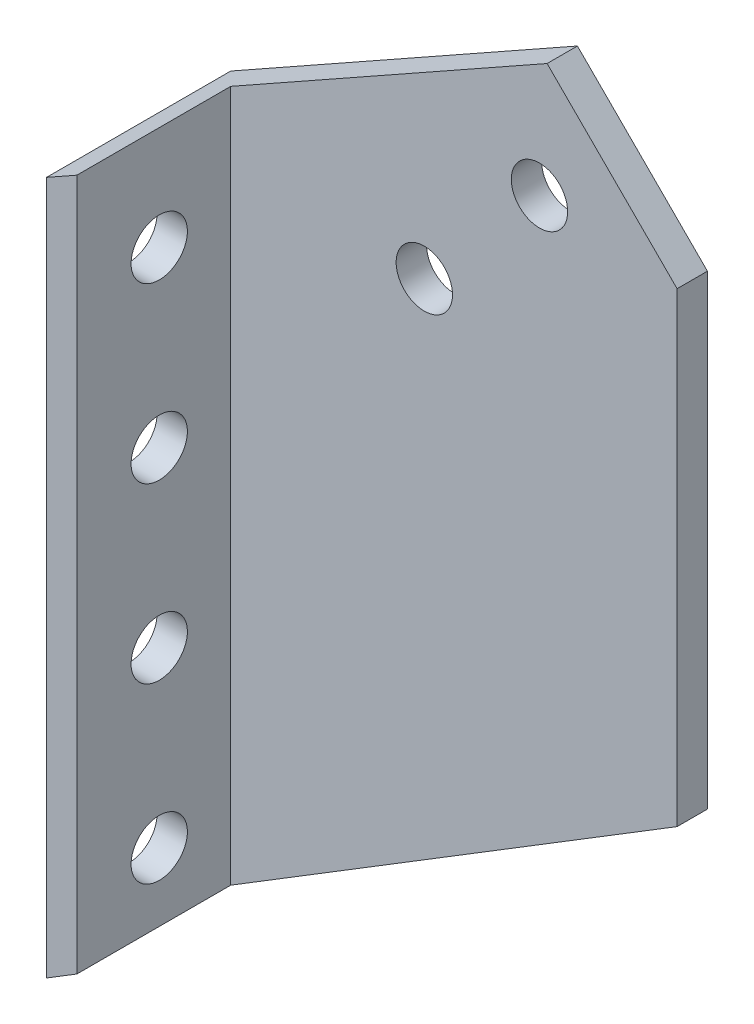
ISO-10303-21;
HEADER;
FILE_DESCRIPTION(('STEP AP214'),'2;1');
FILE_NAME('part.step','',(''),(''),'','','');
FILE_SCHEMA(('AUTOMOTIVE_DESIGN { 1 0 10303 214 1 1 1 1 }'));
ENDSEC;
DATA;
#1=APPLICATION_CONTEXT('core data for automotive mechanical design processes');
#2=APPLICATION_PROTOCOL_DEFINITION('international standard','automotive_design',2000,#1);
#3=PRODUCT_CONTEXT('',#1,'mechanical');
#4=PRODUCT('Part','Part','',(#3));
#5=PRODUCT_RELATED_PRODUCT_CATEGORY('part','',(#4));
#6=PRODUCT_DEFINITION_FORMATION('','',#4);
#7=PRODUCT_DEFINITION_CONTEXT('part definition',#1,'design');
#8=PRODUCT_DEFINITION('design','',#6,#7);
#9=PRODUCT_DEFINITION_SHAPE('','',#8);
#10=(LENGTH_UNIT() NAMED_UNIT(*) SI_UNIT(.MILLI.,.METRE.));
#11=(NAMED_UNIT(*) PLANE_ANGLE_UNIT() SI_UNIT($,.RADIAN.));
#12=(NAMED_UNIT(*) SI_UNIT($,.STERADIAN.) SOLID_ANGLE_UNIT());
#13=UNCERTAINTY_MEASURE_WITH_UNIT(LENGTH_MEASURE(1.E-05),#10,'distance_accuracy_value','');
#14=(GEOMETRIC_REPRESENTATION_CONTEXT(3) GLOBAL_UNCERTAINTY_ASSIGNED_CONTEXT((#13)) GLOBAL_UNIT_ASSIGNED_CONTEXT((#10,
#11,#12)) REPRESENTATION_CONTEXT('',''));
#15=CARTESIAN_POINT('',(0.,0.,0.));
#16=DIRECTION('',(0.,0.,1.));
#17=DIRECTION('',(1.,0.,0.));
#18=AXIS2_PLACEMENT_3D('',#15,#16,#17);
#19=CARTESIAN_POINT('',(233.582996255987,153.383897007896,14.));
#20=DIRECTION('',(0.,0.,1.));
#21=DIRECTION('',(1.,0.,0.));
#22=AXIS2_PLACEMENT_3D('',#19,#20,#21);
#23=PLANE('',#22);
#24=DIRECTION('',(0.,1.,0.));
#25=VECTOR('',#24,1.);
#26=CARTESIAN_POINT('',(-105.656440363729,264.498333627615,14.));
#27=LINE('',#26,#25);
#28=CARTESIAN_POINT('',(-105.656440363729,-54.7857572814754,14.));
#29=VERTEX_POINT('',#28);
#30=CARTESIAN_POINT('',(-105.656440363729,264.498333627615,14.));
#31=VERTEX_POINT('',#30);
#32=EDGE_CURVE('E52',#29,#31,#27,.T.);
#33=ORIENTED_EDGE('',*,*,#32,.F.);
#34=DIRECTION('',(0.852322728648666,0.52301621985259,0.));
#35=VECTOR('',#34,1.);
#36=CARTESIAN_POINT('',(-119.656440363729,-63.3766663723846,14.));
#37=LINE('',#36,#35);
#38=CARTESIAN_POINT('',(100.343559636271,71.6233336276154,14.));
#39=VERTEX_POINT('',#38);
#40=EDGE_CURVE('E85',#29,#39,#37,.T.);
#41=ORIENTED_EDGE('',*,*,#40,.T.);
#42=DIRECTION('',(0.,1.,0.));
#43=VECTOR('',#42,1.);
#44=CARTESIAN_POINT('',(100.343559636271,71.6233336276154,14.));
#45=LINE('',#44,#43);
#46=CARTESIAN_POINT('',(100.343559636271,286.623333627615,14.));
#47=VERTEX_POINT('',#46);
#48=EDGE_CURVE('E202',#39,#47,#45,.T.);
#49=ORIENTED_EDGE('',*,*,#48,.T.);
#50=DIRECTION('',(-0.70710678118654,0.707106781186555,0.));
#51=VECTOR('',#50,1.);
#52=CARTESIAN_POINT('',(100.343559636271,286.623333627615,14.));
#53=LINE('',#52,#51);
#54=CARTESIAN_POINT('',(40.3435596362774,346.62333362761,14.));
#55=VERTEX_POINT('',#54);
#56=EDGE_CURVE('E59',#47,#55,#53,.T.);
#57=ORIENTED_EDGE('',*,*,#56,.T.);
#58=DIRECTION('',(-0.87157553712457,-0.490261239632521,0.));
#59=VECTOR('',#58,1.);
#60=CARTESIAN_POINT('',(40.3435596362774,346.62333362761,14.));
#61=LINE('',#60,#59);
#62=EDGE_CURVE('E140',#55,#31,#61,.T.);
#63=ORIENTED_EDGE('',*,*,#62,.T.);
#64=EDGE_LOOP('',(#33,#41,#49,#57,#63));
#65=FACE_BOUND('',#64,.T.);
#66=CARTESIAN_POINT('',(-16.3182150153104,232.316337144602,14.));
#67=DIRECTION('',(0.,0.,1.));
#68=DIRECTION('',(1.,0.,0.));
#69=AXIS2_PLACEMENT_3D('',#66,#67,#68);
#70=CIRCLE('',#69,13.);
#71=CARTESIAN_POINT('',(-3.31821501531039,232.316337144602,14.));
#72=VERTEX_POINT('',#71);
#73=EDGE_CURVE('E212',#72,#72,#70,.T.);
#74=ORIENTED_EDGE('',*,*,#73,.F.);
#75=EDGE_LOOP('',(#74));
#76=FACE_BOUND('',#75,.T.);
#77=CARTESIAN_POINT('',(36.8308920910834,292.109082639294,14.));
#78=DIRECTION('',(0.,0.,1.));
#79=DIRECTION('',(1.,0.,0.));
#80=AXIS2_PLACEMENT_3D('',#77,#78,#79);
#81=CIRCLE('',#80,13.);
#82=CARTESIAN_POINT('',(49.8308920910834,292.109082639294,14.));
#83=VERTEX_POINT('',#82);
#84=EDGE_CURVE('E136',#83,#83,#81,.T.);
#85=ORIENTED_EDGE('',*,*,#84,.F.);
#86=EDGE_LOOP('',(#85));
#87=FACE_BOUND('',#86,.T.);
#88=ADVANCED_FACE('F35',(#65,#76,#87),#23,.T.);
#89=CARTESIAN_POINT('',(233.582996255987,153.383897007896,0.));
#90=DIRECTION('',(0.,0.,1.));
#91=DIRECTION('',(1.,0.,0.));
#92=AXIS2_PLACEMENT_3D('',#89,#90,#91);
#93=PLANE('',#92);
#94=CARTESIAN_POINT('',(-16.3182150153104,232.316337144602,0.));
#95=DIRECTION('',(0.,0.,1.));
#96=DIRECTION('',(1.,0.,0.));
#97=AXIS2_PLACEMENT_3D('',#94,#95,#96);
#98=CIRCLE('',#97,13.);
#99=CARTESIAN_POINT('',(-3.31821501531039,232.316337144602,0.));
#100=VERTEX_POINT('',#99);
#101=EDGE_CURVE('E222',#100,#100,#98,.T.);
#102=ORIENTED_EDGE('',*,*,#101,.T.);
#103=EDGE_LOOP('',(#102));
#104=FACE_BOUND('',#103,.T.);
#105=DIRECTION('',(0.852322728648666,0.52301621985259,0.));
#106=VECTOR('',#105,1.);
#107=CARTESIAN_POINT('',(-119.656440363729,-63.3766663723846,0.));
#108=LINE('',#107,#106);
#109=CARTESIAN_POINT('',(-119.656440363729,-63.3766663723846,0.));
#110=VERTEX_POINT('',#109);
#111=CARTESIAN_POINT('',(100.343559636271,71.6233336276154,0.));
#112=VERTEX_POINT('',#111);
#113=EDGE_CURVE('E208',#110,#112,#108,.T.);
#114=ORIENTED_EDGE('',*,*,#113,.F.);
#115=DIRECTION('',(0.,-1.,0.));
#116=VECTOR('',#115,1.);
#117=CARTESIAN_POINT('',(-119.656440363729,-63.3766663723846,0.));
#118=LINE('',#117,#116);
#119=CARTESIAN_POINT('',(-119.656440363729,256.623333627615,0.));
#120=VERTEX_POINT('',#119);
#121=EDGE_CURVE('E83',#120,#110,#118,.T.);
#122=ORIENTED_EDGE('',*,*,#121,.F.);
#123=DIRECTION('',(-0.87157553712457,-0.490261239632521,0.));
#124=VECTOR('',#123,1.);
#125=CARTESIAN_POINT('',(40.3435596362774,346.62333362761,0.));
#126=LINE('',#125,#124);
#127=CARTESIAN_POINT('',(40.3435596362774,346.62333362761,0.));
#128=VERTEX_POINT('',#127);
#129=EDGE_CURVE('E109',#128,#120,#126,.T.);
#130=ORIENTED_EDGE('',*,*,#129,.F.);
#131=DIRECTION('',(-0.70710678118654,0.707106781186555,0.));
#132=VECTOR('',#131,1.);
#133=CARTESIAN_POINT('',(100.343559636271,286.623333627615,0.));
#134=LINE('',#133,#132);
#135=CARTESIAN_POINT('',(100.343559636271,286.623333627615,0.));
#136=VERTEX_POINT('',#135);
#137=EDGE_CURVE('E214',#136,#128,#134,.T.);
#138=ORIENTED_EDGE('',*,*,#137,.F.);
#139=DIRECTION('',(0.,1.,0.));
#140=VECTOR('',#139,1.);
#141=CARTESIAN_POINT('',(100.343559636271,71.6233336276154,0.));
#142=LINE('',#141,#140);
#143=EDGE_CURVE('E211',#112,#136,#142,.T.);
#144=ORIENTED_EDGE('',*,*,#143,.F.);
#145=EDGE_LOOP('',(#114,#122,#130,#138,#144));
#146=FACE_BOUND('',#145,.T.);
#147=CARTESIAN_POINT('',(36.8308920910834,292.109082639294,0.));
#148=DIRECTION('',(0.,0.,1.));
#149=DIRECTION('',(1.,0.,0.));
#150=AXIS2_PLACEMENT_3D('',#147,#148,#149);
#151=CIRCLE('',#150,13.);
#152=CARTESIAN_POINT('',(49.8308920910834,292.109082639294,0.));
#153=VERTEX_POINT('',#152);
#154=EDGE_CURVE('E149',#153,#153,#151,.T.);
#155=ORIENTED_EDGE('',*,*,#154,.T.);
#156=EDGE_LOOP('',(#155));
#157=FACE_BOUND('',#156,.T.);
#158=ADVANCED_FACE('F235',(#104,#146,#157),#93,.F.);
#159=CARTESIAN_POINT('',(-119.656440363729,-63.3766663723846,14.));
#160=DIRECTION('',(-0.52301621985259,0.852322728648666,0.));
#161=DIRECTION('',(-0.852322728648666,-0.52301621985259,0.));
#162=AXIS2_PLACEMENT_3D('',#159,#160,#161);
#163=PLANE('',#162);
#164=ORIENTED_EDGE('',*,*,#113,.T.);
#165=DIRECTION('',(0.,0.,-1.));
#166=VECTOR('',#165,1.);
#167=CARTESIAN_POINT('',(100.343559636271,71.6233336276154,14.));
#168=LINE('',#167,#166);
#169=EDGE_CURVE('E11',#39,#112,#168,.T.);
#170=ORIENTED_EDGE('',*,*,#169,.F.);
#171=ORIENTED_EDGE('',*,*,#40,.F.);
#172=DIRECTION('',(0.,0.,-1.));
#173=VECTOR('',#172,1.);
#174=CARTESIAN_POINT('',(-105.656440363729,-54.7857572814754,85.));
#175=LINE('',#174,#173);
#176=CARTESIAN_POINT('',(-105.656440363729,-54.7857572814754,85.));
#177=VERTEX_POINT('',#176);
#178=EDGE_CURVE('E144',#177,#29,#175,.T.);
#179=ORIENTED_EDGE('',*,*,#178,.F.);
#180=DIRECTION('',(0.852322728648666,0.52301621985259,0.));
#181=VECTOR('',#180,1.);
#182=CARTESIAN_POINT('',(-119.656440363729,-63.3766663723846,85.));
#183=LINE('',#182,#181);
#184=CARTESIAN_POINT('',(-119.656440363729,-63.3766663723846,85.));
#185=VERTEX_POINT('',#184);
#186=EDGE_CURVE('E118',#185,#177,#183,.T.);
#187=ORIENTED_EDGE('',*,*,#186,.F.);
#188=DIRECTION('',(0.,0.,-1.));
#189=VECTOR('',#188,1.);
#190=CARTESIAN_POINT('',(-119.656440363729,-63.3766663723846,14.));
#191=LINE('',#190,#189);
#192=EDGE_CURVE('E111',#185,#110,#191,.T.);
#193=ORIENTED_EDGE('',*,*,#192,.T.);
#194=EDGE_LOOP('',(#164,#170,#171,#179,#187,#193));
#195=FACE_BOUND('',#194,.T.);
#196=ADVANCED_FACE('F37',(#195),#163,.F.);
#197=CARTESIAN_POINT('',(100.343559636271,71.6233336276154,14.));
#198=DIRECTION('',(-1.,0.,0.));
#199=DIRECTION('',(0.,0.,1.));
#200=AXIS2_PLACEMENT_3D('',#197,#198,#199);
#201=PLANE('',#200);
#202=ORIENTED_EDGE('',*,*,#143,.T.);
#203=DIRECTION('',(0.,0.,-1.));
#204=VECTOR('',#203,1.);
#205=CARTESIAN_POINT('',(100.343559636271,286.623333627615,14.));
#206=LINE('',#205,#204);
#207=EDGE_CURVE('E44',#47,#136,#206,.T.);
#208=ORIENTED_EDGE('',*,*,#207,.F.);
#209=ORIENTED_EDGE('',*,*,#48,.F.);
#210=ORIENTED_EDGE('',*,*,#169,.T.);
#211=EDGE_LOOP('',(#202,#208,#209,#210));
#212=FACE_BOUND('',#211,.T.);
#213=ADVANCED_FACE('F250',(#212),#201,.F.);
#214=CARTESIAN_POINT('',(100.343559636271,286.623333627615,14.));
#215=DIRECTION('',(-0.707106781186555,-0.70710678118654,0.));
#216=DIRECTION('',(0.70710678118654,-0.707106781186555,0.));
#217=AXIS2_PLACEMENT_3D('',#214,#215,#216);
#218=PLANE('',#217);
#219=ORIENTED_EDGE('',*,*,#137,.T.);
#220=DIRECTION('',(0.,0.,-1.));
#221=VECTOR('',#220,1.);
#222=CARTESIAN_POINT('',(40.3435596362774,346.62333362761,14.));
#223=LINE('',#222,#221);
#224=EDGE_CURVE('E110',#55,#128,#223,.T.);
#225=ORIENTED_EDGE('',*,*,#224,.F.);
#226=ORIENTED_EDGE('',*,*,#56,.F.);
#227=ORIENTED_EDGE('',*,*,#207,.T.);
#228=EDGE_LOOP('',(#219,#225,#226,#227));
#229=FACE_BOUND('',#228,.T.);
#230=ADVANCED_FACE('F248',(#229),#218,.F.);
#231=CARTESIAN_POINT('',(40.3435596362774,346.62333362761,14.));
#232=DIRECTION('',(0.490261239632521,-0.87157553712457,0.));
#233=DIRECTION('',(0.87157553712457,0.490261239632521,0.));
#234=AXIS2_PLACEMENT_3D('',#231,#232,#233);
#235=PLANE('',#234);
#236=ORIENTED_EDGE('',*,*,#129,.T.);
#237=DIRECTION('',(0.,0.,-1.));
#238=VECTOR('',#237,1.);
#239=CARTESIAN_POINT('',(-119.656440363729,256.623333627615,14.));
#240=LINE('',#239,#238);
#241=CARTESIAN_POINT('',(-119.656440363729,256.623333627615,85.));
#242=VERTEX_POINT('',#241);
#243=EDGE_CURVE('E101',#242,#120,#240,.T.);
#244=ORIENTED_EDGE('',*,*,#243,.F.);
#245=DIRECTION('',(-0.871575537124571,-0.490261239632521,0.));
#246=VECTOR('',#245,1.);
#247=CARTESIAN_POINT('',(-105.656440363729,264.498333627615,85.));
#248=LINE('',#247,#246);
#249=CARTESIAN_POINT('',(-105.656440363729,264.498333627615,85.));
#250=VERTEX_POINT('',#249);
#251=EDGE_CURVE('E106',#250,#242,#248,.T.);
#252=ORIENTED_EDGE('',*,*,#251,.F.);
#253=DIRECTION('',(0.,0.,-1.));
#254=VECTOR('',#253,1.);
#255=CARTESIAN_POINT('',(-105.656440363729,264.498333627615,85.));
#256=LINE('',#255,#254);
#257=EDGE_CURVE('E133',#250,#31,#256,.T.);
#258=ORIENTED_EDGE('',*,*,#257,.T.);
#259=ORIENTED_EDGE('',*,*,#62,.F.);
#260=ORIENTED_EDGE('',*,*,#224,.T.);
#261=EDGE_LOOP('',(#236,#244,#252,#258,#259,#260));
#262=FACE_BOUND('',#261,.T.);
#263=ADVANCED_FACE('F103',(#262),#235,.F.);
#264=CARTESIAN_POINT('',(-119.656440363729,-63.3766663723846,14.));
#265=DIRECTION('',(1.,0.,0.));
#266=DIRECTION('',(0.,1.,0.));
#267=AXIS2_PLACEMENT_3D('',#264,#265,#266);
#268=PLANE('',#267);
#269=CARTESIAN_POINT('',(-119.656440363729,-23.3766663723845,47.));
#270=DIRECTION('',(-1.,0.,0.));
#271=DIRECTION('',(0.,-1.,0.));
#272=AXIS2_PLACEMENT_3D('',#269,#270,#271);
#273=CIRCLE('',#272,13.);
#274=CARTESIAN_POINT('',(-119.656440363729,-36.3766663723845,47.));
#275=VERTEX_POINT('',#274);
#276=EDGE_CURVE('E168',#275,#275,#273,.T.);
#277=ORIENTED_EDGE('',*,*,#276,.F.);
#278=EDGE_LOOP('',(#277));
#279=FACE_BOUND('',#278,.T.);
#280=CARTESIAN_POINT('',(-119.656440363729,56.6233336276155,47.));
#281=DIRECTION('',(-1.,0.,0.));
#282=DIRECTION('',(0.,-1.,0.));
#283=AXIS2_PLACEMENT_3D('',#280,#281,#282);
#284=CIRCLE('',#283,13.);
#285=CARTESIAN_POINT('',(-119.656440363729,43.6233336276155,47.));
#286=VERTEX_POINT('',#285);
#287=EDGE_CURVE('E159',#286,#286,#284,.T.);
#288=ORIENTED_EDGE('',*,*,#287,.F.);
#289=EDGE_LOOP('',(#288));
#290=FACE_BOUND('',#289,.T.);
#291=CARTESIAN_POINT('',(-119.656440363729,136.623333627615,47.));
#292=DIRECTION('',(-1.,0.,0.));
#293=DIRECTION('',(0.,-1.,0.));
#294=AXIS2_PLACEMENT_3D('',#291,#292,#293);
#295=CIRCLE('',#294,13.);
#296=CARTESIAN_POINT('',(-119.656440363729,123.623333627615,47.));
#297=VERTEX_POINT('',#296);
#298=EDGE_CURVE('E156',#297,#297,#295,.T.);
#299=ORIENTED_EDGE('',*,*,#298,.F.);
#300=EDGE_LOOP('',(#299));
#301=FACE_BOUND('',#300,.T.);
#302=CARTESIAN_POINT('',(-119.656440363729,216.623333627615,47.));
#303=DIRECTION('',(-1.,0.,0.));
#304=DIRECTION('',(0.,-1.,0.));
#305=AXIS2_PLACEMENT_3D('',#302,#303,#304);
#306=CIRCLE('',#305,13.);
#307=CARTESIAN_POINT('',(-119.656440363729,203.623333627615,47.));
#308=VERTEX_POINT('',#307);
#309=EDGE_CURVE('E128',#308,#308,#306,.T.);
#310=ORIENTED_EDGE('',*,*,#309,.F.);
#311=EDGE_LOOP('',(#310));
#312=FACE_BOUND('',#311,.T.);
#313=ORIENTED_EDGE('',*,*,#121,.T.);
#314=ORIENTED_EDGE('',*,*,#192,.F.);
#315=DIRECTION('',(0.,-1.,0.));
#316=VECTOR('',#315,1.);
#317=CARTESIAN_POINT('',(-119.656440363729,256.623333627615,85.));
#318=LINE('',#317,#316);
#319=EDGE_CURVE('E114',#242,#185,#318,.T.);
#320=ORIENTED_EDGE('',*,*,#319,.F.);
#321=ORIENTED_EDGE('',*,*,#243,.T.);
#322=EDGE_LOOP('',(#313,#314,#320,#321));
#323=FACE_BOUND('',#322,.T.);
#324=ADVANCED_FACE('F115',(#279,#290,#301,#312,#323),#268,.F.);
#325=CARTESIAN_POINT('',(-16.3182150153104,232.316337144602,14.));
#326=DIRECTION('',(0.,0.,-1.));
#327=DIRECTION('',(-1.,0.,0.));
#328=AXIS2_PLACEMENT_3D('',#325,#326,#327);
#329=CYLINDRICAL_SURFACE('',#328,13.);
#330=ORIENTED_EDGE('',*,*,#73,.T.);
#331=EDGE_LOOP('',(#330));
#332=FACE_BOUND('',#331,.T.);
#333=ORIENTED_EDGE('',*,*,#101,.F.);
#334=EDGE_LOOP('',(#333));
#335=FACE_BOUND('',#334,.T.);
#336=ADVANCED_FACE('F178',(#332,#335),#329,.F.);
#337=CARTESIAN_POINT('',(36.8308920910834,292.109082639294,14.));
#338=DIRECTION('',(0.,0.,-1.));
#339=DIRECTION('',(-1.,0.,0.));
#340=AXIS2_PLACEMENT_3D('',#337,#338,#339);
#341=CYLINDRICAL_SURFACE('',#340,13.);
#342=ORIENTED_EDGE('',*,*,#84,.T.);
#343=EDGE_LOOP('',(#342));
#344=FACE_BOUND('',#343,.T.);
#345=ORIENTED_EDGE('',*,*,#154,.F.);
#346=EDGE_LOOP('',(#345));
#347=FACE_BOUND('',#346,.T.);
#348=ADVANCED_FACE('F196',(#344,#347),#341,.F.);
#349=CARTESIAN_POINT('',(-105.656440363729,264.498333627615,85.));
#350=DIRECTION('',(-1.,0.,0.));
#351=DIRECTION('',(0.,-1.,0.));
#352=AXIS2_PLACEMENT_3D('',#349,#350,#351);
#353=PLANE('',#352);
#354=CARTESIAN_POINT('',(-105.656440363729,-23.3766663723845,47.));
#355=DIRECTION('',(-1.,0.,0.));
#356=DIRECTION('',(0.,-1.,0.));
#357=AXIS2_PLACEMENT_3D('',#354,#355,#356);
#358=CIRCLE('',#357,13.);
#359=CARTESIAN_POINT('',(-105.656440363729,-36.3766663723845,47.));
#360=VERTEX_POINT('',#359);
#361=EDGE_CURVE('E39',#360,#360,#358,.T.);
#362=ORIENTED_EDGE('',*,*,#361,.T.);
#363=EDGE_LOOP('',(#362));
#364=FACE_BOUND('',#363,.T.);
#365=CARTESIAN_POINT('',(-105.656440363729,56.6233336276155,47.));
#366=DIRECTION('',(-1.,0.,0.));
#367=DIRECTION('',(0.,-1.,0.));
#368=AXIS2_PLACEMENT_3D('',#365,#366,#367);
#369=CIRCLE('',#368,13.);
#370=CARTESIAN_POINT('',(-105.656440363729,43.6233336276155,47.));
#371=VERTEX_POINT('',#370);
#372=EDGE_CURVE('E157',#371,#371,#369,.T.);
#373=ORIENTED_EDGE('',*,*,#372,.T.);
#374=EDGE_LOOP('',(#373));
#375=FACE_BOUND('',#374,.T.);
#376=CARTESIAN_POINT('',(-105.656440363729,136.623333627615,47.));
#377=DIRECTION('',(-1.,0.,0.));
#378=DIRECTION('',(0.,-1.,0.));
#379=AXIS2_PLACEMENT_3D('',#376,#377,#378);
#380=CIRCLE('',#379,13.);
#381=CARTESIAN_POINT('',(-105.656440363729,123.623333627615,47.));
#382=VERTEX_POINT('',#381);
#383=EDGE_CURVE('E154',#382,#382,#380,.T.);
#384=ORIENTED_EDGE('',*,*,#383,.T.);
#385=EDGE_LOOP('',(#384));
#386=FACE_BOUND('',#385,.T.);
#387=CARTESIAN_POINT('',(-105.656440363729,216.623333627615,47.));
#388=DIRECTION('',(-1.,0.,0.));
#389=DIRECTION('',(0.,-1.,0.));
#390=AXIS2_PLACEMENT_3D('',#387,#388,#389);
#391=CIRCLE('',#390,13.);
#392=CARTESIAN_POINT('',(-105.656440363729,203.623333627615,47.));
#393=VERTEX_POINT('',#392);
#394=EDGE_CURVE('E125',#393,#393,#391,.T.);
#395=ORIENTED_EDGE('',*,*,#394,.T.);
#396=EDGE_LOOP('',(#395));
#397=FACE_BOUND('',#396,.T.);
#398=ORIENTED_EDGE('',*,*,#32,.T.);
#399=ORIENTED_EDGE('',*,*,#257,.F.);
#400=DIRECTION('',(0.,1.,0.));
#401=VECTOR('',#400,1.);
#402=CARTESIAN_POINT('',(-105.656440363729,264.498333627615,85.));
#403=LINE('',#402,#401);
#404=EDGE_CURVE('E122',#177,#250,#403,.T.);
#405=ORIENTED_EDGE('',*,*,#404,.F.);
#406=ORIENTED_EDGE('',*,*,#178,.T.);
#407=EDGE_LOOP('',(#398,#399,#405,#406));
#408=FACE_BOUND('',#407,.T.);
#409=ADVANCED_FACE('F193',(#364,#375,#386,#397,#408),#353,.F.);
#410=CARTESIAN_POINT('',(-119.656440363729,256.623333627615,85.));
#411=DIRECTION('',(0.,0.,1.));
#412=DIRECTION('',(1.,0.,0.));
#413=AXIS2_PLACEMENT_3D('',#410,#411,#412);
#414=PLANE('',#413);
#415=ORIENTED_EDGE('',*,*,#251,.T.);
#416=ORIENTED_EDGE('',*,*,#319,.T.);
#417=ORIENTED_EDGE('',*,*,#186,.T.);
#418=ORIENTED_EDGE('',*,*,#404,.T.);
#419=EDGE_LOOP('',(#415,#416,#417,#418));
#420=FACE_BOUND('',#419,.T.);
#421=ADVANCED_FACE('F120',(#420),#414,.T.);
#422=CARTESIAN_POINT('',(100.343584636271,216.623333627615,47.));
#423=DIRECTION('',(-1.,0.,0.));
#424=DIRECTION('',(0.,-1.,0.));
#425=AXIS2_PLACEMENT_3D('',#422,#423,#424);
#426=CYLINDRICAL_SURFACE('',#425,13.);
#427=ORIENTED_EDGE('',*,*,#309,.T.);
#428=EDGE_LOOP('',(#427));
#429=FACE_BOUND('',#428,.T.);
#430=ORIENTED_EDGE('',*,*,#394,.F.);
#431=EDGE_LOOP('',(#430));
#432=FACE_BOUND('',#431,.T.);
#433=ADVANCED_FACE('F186',(#429,#432),#426,.F.);
#434=CARTESIAN_POINT('',(100.343584636271,136.623333627615,47.));
#435=DIRECTION('',(-1.,0.,0.));
#436=DIRECTION('',(0.,-1.,0.));
#437=AXIS2_PLACEMENT_3D('',#434,#435,#436);
#438=CYLINDRICAL_SURFACE('',#437,13.);
#439=ORIENTED_EDGE('',*,*,#298,.T.);
#440=EDGE_LOOP('',(#439));
#441=FACE_BOUND('',#440,.T.);
#442=ORIENTED_EDGE('',*,*,#383,.F.);
#443=EDGE_LOOP('',(#442));
#444=FACE_BOUND('',#443,.T.);
#445=ADVANCED_FACE('F189',(#441,#444),#438,.F.);
#446=CARTESIAN_POINT('',(100.343584636271,56.6233336276154,47.));
#447=DIRECTION('',(-1.,0.,0.));
#448=DIRECTION('',(0.,-1.,0.));
#449=AXIS2_PLACEMENT_3D('',#446,#447,#448);
#450=CYLINDRICAL_SURFACE('',#449,13.);
#451=CARTESIAN_POINT('',(-119.656440363729,43.6233336276155,47.));
#452=CARTESIAN_POINT('',(-119.510607030396,43.6233336276155,47.));
#453=CARTESIAN_POINT('',(-119.364773697063,43.6233336276155,47.));
#454=CARTESIAN_POINT('',(-119.073107030396,43.6233336276155,47.));
#455=CARTESIAN_POINT('',(-118.927273697063,43.6233336276155,47.));
#456=CARTESIAN_POINT('',(-118.635607030396,43.6233336276155,47.));
#457=CARTESIAN_POINT('',(-118.489773697063,43.6233336276155,47.));
#458=CARTESIAN_POINT('',(-118.198107030396,43.6233336276155,47.));
#459=CARTESIAN_POINT('',(-118.052273697063,43.6233336276155,47.));
#460=CARTESIAN_POINT('',(-117.760607030396,43.6233336276155,47.));
#461=CARTESIAN_POINT('',(-117.614773697063,43.6233336276155,47.));
#462=CARTESIAN_POINT('',(-117.323107030396,43.6233336276155,47.));
#463=CARTESIAN_POINT('',(-117.177273697063,43.6233336276155,47.));
#464=CARTESIAN_POINT('',(-116.885607030396,43.6233336276155,47.));
#465=CARTESIAN_POINT('',(-116.739773697063,43.6233336276155,47.));
#466=CARTESIAN_POINT('',(-116.448107030396,43.6233336276155,47.));
#467=CARTESIAN_POINT('',(-116.302273697063,43.6233336276155,47.));
#468=CARTESIAN_POINT('',(-116.010607030396,43.6233336276155,47.));
#469=CARTESIAN_POINT('',(-115.864773697063,43.6233336276155,47.));
#470=CARTESIAN_POINT('',(-115.573107030396,43.6233336276155,47.));
#471=CARTESIAN_POINT('',(-115.427273697063,43.6233336276155,47.));
#472=CARTESIAN_POINT('',(-115.135607030396,43.6233336276155,47.));
#473=CARTESIAN_POINT('',(-114.989773697063,43.6233336276155,47.));
#474=CARTESIAN_POINT('',(-114.698107030396,43.6233336276155,47.));
#475=CARTESIAN_POINT('',(-114.552273697063,43.6233336276155,47.));
#476=CARTESIAN_POINT('',(-114.260607030396,43.6233336276155,47.));
#477=CARTESIAN_POINT('',(-114.114773697063,43.6233336276155,47.));
#478=CARTESIAN_POINT('',(-113.823107030396,43.6233336276155,47.));
#479=CARTESIAN_POINT('',(-113.677273697063,43.6233336276155,47.));
#480=CARTESIAN_POINT('',(-113.385607030396,43.6233336276155,47.));
#481=CARTESIAN_POINT('',(-113.239773697063,43.6233336276155,47.));
#482=CARTESIAN_POINT('',(-112.948107030396,43.6233336276155,47.));
#483=CARTESIAN_POINT('',(-112.802273697063,43.6233336276155,47.));
#484=CARTESIAN_POINT('',(-112.510607030396,43.6233336276155,47.));
#485=CARTESIAN_POINT('',(-112.364773697063,43.6233336276155,47.));
#486=CARTESIAN_POINT('',(-112.073107030396,43.6233336276155,47.));
#487=CARTESIAN_POINT('',(-111.927273697063,43.6233336276155,47.));
#488=CARTESIAN_POINT('',(-111.635607030396,43.6233336276155,47.));
#489=CARTESIAN_POINT('',(-111.489773697063,43.6233336276155,47.));
#490=CARTESIAN_POINT('',(-111.198107030396,43.6233336276155,47.));
#491=CARTESIAN_POINT('',(-111.052273697063,43.6233336276155,47.));
#492=CARTESIAN_POINT('',(-110.760607030396,43.6233336276155,47.));
#493=CARTESIAN_POINT('',(-110.614773697063,43.6233336276155,47.));
#494=CARTESIAN_POINT('',(-110.323107030396,43.6233336276155,47.));
#495=CARTESIAN_POINT('',(-110.177273697063,43.6233336276155,47.));
#496=CARTESIAN_POINT('',(-109.885607030396,43.6233336276155,47.));
#497=CARTESIAN_POINT('',(-109.739773697062,43.6233336276155,47.));
#498=CARTESIAN_POINT('',(-109.448107030396,43.6233336276155,47.));
#499=CARTESIAN_POINT('',(-109.302273697062,43.6233336276155,47.));
#500=CARTESIAN_POINT('',(-109.010607030396,43.6233336276155,47.));
#501=CARTESIAN_POINT('',(-108.864773697063,43.6233336276155,47.));
#502=CARTESIAN_POINT('',(-108.573107030396,43.6233336276155,47.));
#503=CARTESIAN_POINT('',(-108.427273697062,43.6233336276155,47.));
#504=CARTESIAN_POINT('',(-108.135607030396,43.6233336276155,47.));
#505=CARTESIAN_POINT('',(-107.989773697062,43.6233336276155,47.));
#506=CARTESIAN_POINT('',(-107.698107030396,43.6233336276155,47.));
#507=CARTESIAN_POINT('',(-107.552273697062,43.6233336276155,47.));
#508=CARTESIAN_POINT('',(-107.260607030396,43.6233336276155,47.));
#509=CARTESIAN_POINT('',(-107.114773697062,43.6233336276155,47.));
#510=CARTESIAN_POINT('',(-106.823107030396,43.6233336276155,47.));
#511=CARTESIAN_POINT('',(-106.677273697062,43.6233336276155,47.));
#512=CARTESIAN_POINT('',(-106.385607030396,43.6233336276155,47.));
#513=CARTESIAN_POINT('',(-106.239773697062,43.6233336276155,47.));
#514=CARTESIAN_POINT('',(-105.948107030396,43.6233336276155,47.));
#515=CARTESIAN_POINT('',(-105.802273697062,43.6233336276155,47.));
#516=CARTESIAN_POINT('',(-105.656440363729,43.6233336276155,47.));
#517=B_SPLINE_CURVE_WITH_KNOTS('',3,(#451,#452,#453,#454,#455,#456,#457,#458,#459,#460,#461,
#462,#463,#464,#465,#466,#467,#468,#469,#470,#471,#472,#473,#474,#475,#476,#477,#478,#479,#480,
#481,#482,#483,#484,#485,#486,#487,#488,#489,#490,#491,#492,#493,#494,#495,#496,#497,#498,#499,
#500,#501,#502,#503,#504,#505,#506,#507,#508,#509,#510,#511,#512,#513,#514,#515,#516),
.UNSPECIFIED.,.F.,.F.,(4,2,2,2,2,2,2,2,2,2,2,2,2,2,2,2,2,2,2,2,2,2,2,2,2,2,2,2,2,2,2,2,4),(0.,
0.437500000000007,0.875000000000015,1.31249999999999,1.75,2.18750000000001,2.62500000000002,
3.06250000000002,3.5,3.93750000000001,4.37500000000002,4.81250000000002,5.25000000000003,
5.68750000000004,6.12500000000002,6.56250000000003,7.00000000000003,7.43750000000004,
7.87500000000005,8.31250000000003,8.75000000000004,9.18750000000004,9.62500000000005,
10.0625000000001,10.5000000000001,10.9375,11.3750000000001,11.8125000000001,12.2500000000001,
12.6875000000001,13.1250000000001,13.5625000000001,14.0000000000001),.UNSPECIFIED.);
#518=EDGE_CURVE('BSEAM325',#286,#371,#517,.T.);
#519=ORIENTED_EDGE('',*,*,#287,.T.);
#520=ORIENTED_EDGE('',*,*,#372,.F.);
#521=ORIENTED_EDGE('',*,*,#518,.T.);
#522=ORIENTED_EDGE('',*,*,#518,.F.);
#523=EDGE_LOOP('',(#519,#521,#520,#522));
#524=FACE_BOUND('',#523,.T.);
#525=ADVANCED_FACE('F325',(#524),#450,.F.);
#526=CARTESIAN_POINT('',(100.343584636271,-23.3766663723845,47.));
#527=DIRECTION('',(-1.,0.,0.));
#528=DIRECTION('',(0.,-1.,0.));
#529=AXIS2_PLACEMENT_3D('',#526,#527,#528);
#530=CYLINDRICAL_SURFACE('',#529,13.);
#531=ORIENTED_EDGE('',*,*,#276,.T.);
#532=EDGE_LOOP('',(#531));
#533=FACE_BOUND('',#532,.T.);
#534=ORIENTED_EDGE('',*,*,#361,.F.);
#535=EDGE_LOOP('',(#534));
#536=FACE_BOUND('',#535,.T.);
#537=ADVANCED_FACE('F173',(#533,#536),#530,.F.);
#538=CLOSED_SHELL('',(#88,#158,#196,#213,#230,#263,#324,#336,#348,#409,#421,#433,#445,#525,#537));
#539=MANIFOLD_SOLID_BREP('B2',#538);
#540=ADVANCED_BREP_SHAPE_REPRESENTATION('',(#18,#539),#14);
#541=SHAPE_DEFINITION_REPRESENTATION(#9,#540);
ENDSEC;
END-ISO-10303-21;
